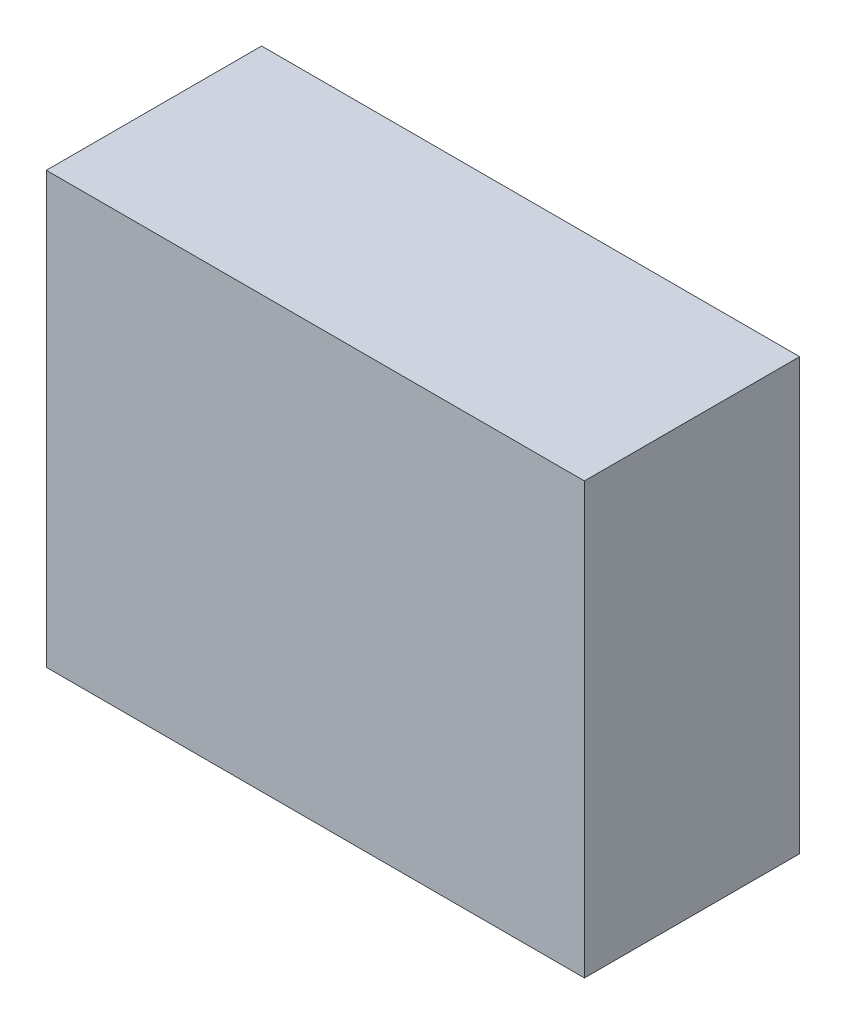
ISO-10303-21;
HEADER;
FILE_DESCRIPTION(('STEP AP214'),'2;1');
FILE_NAME('part.step','',(''),(''),'','','');
FILE_SCHEMA(('AUTOMOTIVE_DESIGN { 1 0 10303 214 1 1 1 1 }'));
ENDSEC;
DATA;
#1=APPLICATION_CONTEXT('core data for automotive mechanical design processes');
#2=APPLICATION_PROTOCOL_DEFINITION('international standard','automotive_design',2000,#1);
#3=PRODUCT_CONTEXT('',#1,'mechanical');
#4=PRODUCT('Part','Part','',(#3));
#5=PRODUCT_RELATED_PRODUCT_CATEGORY('part','',(#4));
#6=PRODUCT_DEFINITION_FORMATION('','',#4);
#7=PRODUCT_DEFINITION_CONTEXT('part definition',#1,'design');
#8=PRODUCT_DEFINITION('design','',#6,#7);
#9=PRODUCT_DEFINITION_SHAPE('','',#8);
#10=(LENGTH_UNIT() NAMED_UNIT(*) SI_UNIT(.MILLI.,.METRE.));
#11=(NAMED_UNIT(*) PLANE_ANGLE_UNIT() SI_UNIT($,.RADIAN.));
#12=(NAMED_UNIT(*) SI_UNIT($,.STERADIAN.) SOLID_ANGLE_UNIT());
#13=UNCERTAINTY_MEASURE_WITH_UNIT(LENGTH_MEASURE(1.E-05),#10,'distance_accuracy_value','');
#14=(GEOMETRIC_REPRESENTATION_CONTEXT(3) GLOBAL_UNCERTAINTY_ASSIGNED_CONTEXT((#13)) GLOBAL_UNIT_ASSIGNED_CONTEXT((#10,
#11,#12)) REPRESENTATION_CONTEXT('',''));
#15=CARTESIAN_POINT('',(0.,0.,0.));
#16=DIRECTION('',(0.,0.,1.));
#17=DIRECTION('',(1.,0.,0.));
#18=AXIS2_PLACEMENT_3D('',#15,#16,#17);
#19=CARTESIAN_POINT('',(0.,0.,10.));
#20=DIRECTION('',(1.,0.,0.));
#21=DIRECTION('',(0.,0.,-1.));
#22=AXIS2_PLACEMENT_3D('',#19,#20,#21);
#23=PLANE('',#22);
#24=DIRECTION('',(0.,-1.,0.));
#25=VECTOR('',#24,1.);
#26=CARTESIAN_POINT('',(0.,0.,0.));
#27=LINE('',#26,#25);
#28=CARTESIAN_POINT('',(0.,20.,0.));
#29=VERTEX_POINT('',#28);
#30=CARTESIAN_POINT('',(0.,0.,0.));
#31=VERTEX_POINT('',#30);
#32=EDGE_CURVE('E111',#29,#31,#27,.T.);
#33=ORIENTED_EDGE('',*,*,#32,.T.);
#34=DIRECTION('',(0.,0.,-1.));
#35=VECTOR('',#34,1.);
#36=CARTESIAN_POINT('',(0.,0.,10.));
#37=LINE('',#36,#35);
#38=CARTESIAN_POINT('',(0.,0.,10.));
#39=VERTEX_POINT('',#38);
#40=EDGE_CURVE('E11',#39,#31,#37,.T.);
#41=ORIENTED_EDGE('',*,*,#40,.F.);
#42=DIRECTION('',(0.,-1.,0.));
#43=VECTOR('',#42,1.);
#44=CARTESIAN_POINT('',(0.,0.,10.));
#45=LINE('',#44,#43);
#46=CARTESIAN_POINT('',(0.,20.,10.));
#47=VERTEX_POINT('',#46);
#48=EDGE_CURVE('E100',#47,#39,#45,.T.);
#49=ORIENTED_EDGE('',*,*,#48,.F.);
#50=DIRECTION('',(0.,0.,-1.));
#51=VECTOR('',#50,1.);
#52=CARTESIAN_POINT('',(0.,20.,10.));
#53=LINE('',#52,#51);
#54=EDGE_CURVE('E108',#47,#29,#53,.T.);
#55=ORIENTED_EDGE('',*,*,#54,.T.);
#56=EDGE_LOOP('',(#33,#41,#49,#55));
#57=FACE_BOUND('',#56,.T.);
#58=ADVANCED_FACE('F44',(#57),#23,.F.);
#59=CARTESIAN_POINT('',(0.,0.,10.));
#60=DIRECTION('',(0.,1.,0.));
#61=DIRECTION('',(0.,0.,1.));
#62=AXIS2_PLACEMENT_3D('',#59,#60,#61);
#63=PLANE('',#62);
#64=DIRECTION('',(1.,0.,0.));
#65=VECTOR('',#64,1.);
#66=CARTESIAN_POINT('',(0.,0.,0.));
#67=LINE('',#66,#65);
#68=CARTESIAN_POINT('',(25.,0.,0.));
#69=VERTEX_POINT('',#68);
#70=EDGE_CURVE('E105',#31,#69,#67,.T.);
#71=ORIENTED_EDGE('',*,*,#70,.T.);
#72=DIRECTION('',(0.,0.,-1.));
#73=VECTOR('',#72,1.);
#74=CARTESIAN_POINT('',(25.,0.,10.));
#75=LINE('',#74,#73);
#76=CARTESIAN_POINT('',(25.,0.,10.));
#77=VERTEX_POINT('',#76);
#78=EDGE_CURVE('E53',#77,#69,#75,.T.);
#79=ORIENTED_EDGE('',*,*,#78,.F.);
#80=DIRECTION('',(1.,0.,0.));
#81=VECTOR('',#80,1.);
#82=CARTESIAN_POINT('',(0.,0.,10.));
#83=LINE('',#82,#81);
#84=EDGE_CURVE('E95',#39,#77,#83,.T.);
#85=ORIENTED_EDGE('',*,*,#84,.F.);
#86=ORIENTED_EDGE('',*,*,#40,.T.);
#87=EDGE_LOOP('',(#71,#79,#85,#86));
#88=FACE_BOUND('',#87,.T.);
#89=ADVANCED_FACE('F102',(#88),#63,.F.);
#90=CARTESIAN_POINT('',(25.,0.,10.));
#91=DIRECTION('',(-1.,0.,0.));
#92=DIRECTION('',(0.,0.,1.));
#93=AXIS2_PLACEMENT_3D('',#90,#91,#92);
#94=PLANE('',#93);
#95=DIRECTION('',(0.,1.,0.));
#96=VECTOR('',#95,1.);
#97=CARTESIAN_POINT('',(25.,0.,0.));
#98=LINE('',#97,#96);
#99=CARTESIAN_POINT('',(25.,20.,0.));
#100=VERTEX_POINT('',#99);
#101=EDGE_CURVE('E80',#69,#100,#98,.T.);
#102=ORIENTED_EDGE('',*,*,#101,.T.);
#103=DIRECTION('',(0.,0.,-1.));
#104=VECTOR('',#103,1.);
#105=CARTESIAN_POINT('',(25.,20.,10.));
#106=LINE('',#105,#104);
#107=CARTESIAN_POINT('',(25.,20.,10.));
#108=VERTEX_POINT('',#107);
#109=EDGE_CURVE('E101',#108,#100,#106,.T.);
#110=ORIENTED_EDGE('',*,*,#109,.F.);
#111=DIRECTION('',(0.,1.,0.));
#112=VECTOR('',#111,1.);
#113=CARTESIAN_POINT('',(25.,0.,10.));
#114=LINE('',#113,#112);
#115=EDGE_CURVE('E94',#77,#108,#114,.T.);
#116=ORIENTED_EDGE('',*,*,#115,.F.);
#117=ORIENTED_EDGE('',*,*,#78,.T.);
#118=EDGE_LOOP('',(#102,#110,#116,#117));
#119=FACE_BOUND('',#118,.T.);
#120=ADVANCED_FACE('F103',(#119),#94,.F.);
#121=CARTESIAN_POINT('',(0.,20.,10.));
#122=DIRECTION('',(0.,-1.,0.));
#123=DIRECTION('',(0.,0.,-1.));
#124=AXIS2_PLACEMENT_3D('',#121,#122,#123);
#125=PLANE('',#124);
#126=DIRECTION('',(-1.,0.,0.));
#127=VECTOR('',#126,1.);
#128=CARTESIAN_POINT('',(0.,20.,0.));
#129=LINE('',#128,#127);
#130=EDGE_CURVE('E82',#100,#29,#129,.T.);
#131=ORIENTED_EDGE('',*,*,#130,.T.);
#132=ORIENTED_EDGE('',*,*,#54,.F.);
#133=DIRECTION('',(-1.,0.,0.));
#134=VECTOR('',#133,1.);
#135=CARTESIAN_POINT('',(0.,20.,10.));
#136=LINE('',#135,#134);
#137=EDGE_CURVE('E62',#108,#47,#136,.T.);
#138=ORIENTED_EDGE('',*,*,#137,.F.);
#139=ORIENTED_EDGE('',*,*,#109,.T.);
#140=EDGE_LOOP('',(#131,#132,#138,#139));
#141=FACE_BOUND('',#140,.T.);
#142=ADVANCED_FACE('F128',(#141),#125,.F.);
#143=CARTESIAN_POINT('',(0.,0.,10.));
#144=DIRECTION('',(0.,0.,-1.));
#145=DIRECTION('',(-1.,0.,0.));
#146=AXIS2_PLACEMENT_3D('',#143,#144,#145);
#147=PLANE('',#146);
#148=ORIENTED_EDGE('',*,*,#48,.T.);
#149=ORIENTED_EDGE('',*,*,#84,.T.);
#150=ORIENTED_EDGE('',*,*,#115,.T.);
#151=ORIENTED_EDGE('',*,*,#137,.T.);
#152=EDGE_LOOP('',(#148,#149,#150,#151));
#153=FACE_BOUND('',#152,.T.);
#154=ADVANCED_FACE('F93',(#153),#147,.F.);
#155=CARTESIAN_POINT('',(0.,0.,0.));
#156=DIRECTION('',(0.,0.,-1.));
#157=DIRECTION('',(-1.,0.,0.));
#158=AXIS2_PLACEMENT_3D('',#155,#156,#157);
#159=PLANE('',#158);
#160=ORIENTED_EDGE('',*,*,#32,.F.);
#161=ORIENTED_EDGE('',*,*,#130,.F.);
#162=ORIENTED_EDGE('',*,*,#101,.F.);
#163=ORIENTED_EDGE('',*,*,#70,.F.);
#164=EDGE_LOOP('',(#160,#161,#162,#163));
#165=FACE_BOUND('',#164,.T.);
#166=ADVANCED_FACE('F129',(#165),#159,.T.);
#167=CLOSED_SHELL('',(#58,#89,#120,#142,#154,#166));
#168=MANIFOLD_SOLID_BREP('B2',#167);
#169=ADVANCED_BREP_SHAPE_REPRESENTATION('',(#18,#168),#14);
#170=SHAPE_DEFINITION_REPRESENTATION(#9,#169);
ENDSEC;
END-ISO-10303-21;
